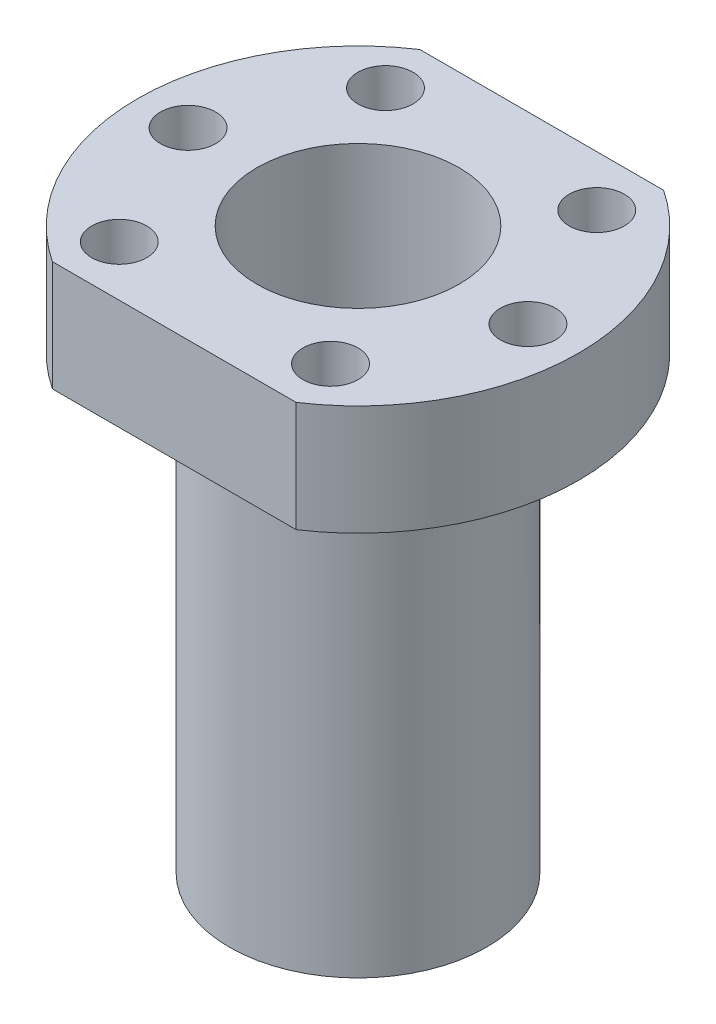
ISO-10303-21;
HEADER;
FILE_DESCRIPTION(('STEP AP214'),'2;1');
FILE_NAME('part.step','',(''),(''),'','','');
FILE_SCHEMA(('AUTOMOTIVE_DESIGN { 1 0 10303 214 1 1 1 1 }'));
ENDSEC;
DATA;
#1=APPLICATION_CONTEXT('core data for automotive mechanical design processes');
#2=APPLICATION_PROTOCOL_DEFINITION('international standard','automotive_design',2000,#1);
#3=PRODUCT_CONTEXT('',#1,'mechanical');
#4=PRODUCT('Part','Part','',(#3));
#5=PRODUCT_RELATED_PRODUCT_CATEGORY('part','',(#4));
#6=PRODUCT_DEFINITION_FORMATION('','',#4);
#7=PRODUCT_DEFINITION_CONTEXT('part definition',#1,'design');
#8=PRODUCT_DEFINITION('design','',#6,#7);
#9=PRODUCT_DEFINITION_SHAPE('','',#8);
#10=(LENGTH_UNIT() NAMED_UNIT(*) SI_UNIT(.MILLI.,.METRE.));
#11=(NAMED_UNIT(*) PLANE_ANGLE_UNIT() SI_UNIT($,.RADIAN.));
#12=(NAMED_UNIT(*) SI_UNIT($,.STERADIAN.) SOLID_ANGLE_UNIT());
#13=UNCERTAINTY_MEASURE_WITH_UNIT(LENGTH_MEASURE(1.E-05),#10,'distance_accuracy_value','');
#14=(GEOMETRIC_REPRESENTATION_CONTEXT(3) GLOBAL_UNCERTAINTY_ASSIGNED_CONTEXT((#13)) GLOBAL_UNIT_ASSIGNED_CONTEXT((#10,
#11,#12)) REPRESENTATION_CONTEXT('',''));
#15=CARTESIAN_POINT('',(0.,0.,0.));
#16=DIRECTION('',(0.,0.,1.));
#17=DIRECTION('',(1.,0.,0.));
#18=AXIS2_PLACEMENT_3D('',#15,#16,#17);
#19=CARTESIAN_POINT('',(0.,0.,0.));
#20=DIRECTION('',(0.,1.,0.));
#21=DIRECTION('',(0.,0.,1.));
#22=AXIS2_PLACEMENT_3D('',#19,#20,#21);
#23=PLANE('',#22);
#24=CARTESIAN_POINT('',(11.5,0.,-14.4913767461894));
#25=DIRECTION('',(0.,1.,0.));
#26=DIRECTION('',(0.,0.,1.));
#27=AXIS2_PLACEMENT_3D('',#24,#25,#26);
#28=CIRCLE('',#27,3.);
#29=CARTESIAN_POINT('',(11.5,0.,-11.4913767461894));
#30=VERTEX_POINT('',#29);
#31=EDGE_CURVE('E241',#30,#30,#28,.T.);
#32=ORIENTED_EDGE('',*,*,#31,.T.);
#33=EDGE_LOOP('',(#32));
#34=FACE_BOUND('',#33,.T.);
#35=CARTESIAN_POINT('',(18.5,0.,0.));
#36=DIRECTION('',(0.,1.,0.));
#37=DIRECTION('',(0.,0.,1.));
#38=AXIS2_PLACEMENT_3D('',#35,#36,#37);
#39=CIRCLE('',#38,3.);
#40=CARTESIAN_POINT('',(18.5,0.,3.));
#41=VERTEX_POINT('',#40);
#42=EDGE_CURVE('E245',#41,#41,#39,.T.);
#43=ORIENTED_EDGE('',*,*,#42,.T.);
#44=EDGE_LOOP('',(#43));
#45=FACE_BOUND('',#44,.T.);
#46=CARTESIAN_POINT('',(11.5,0.,14.4913767461894));
#47=DIRECTION('',(0.,1.,0.));
#48=DIRECTION('',(0.,0.,1.));
#49=AXIS2_PLACEMENT_3D('',#46,#47,#48);
#50=CIRCLE('',#49,3.);
#51=CARTESIAN_POINT('',(11.5,0.,17.4913767461894));
#52=VERTEX_POINT('',#51);
#53=EDGE_CURVE('E254',#52,#52,#50,.T.);
#54=ORIENTED_EDGE('',*,*,#53,.T.);
#55=EDGE_LOOP('',(#54));
#56=FACE_BOUND('',#55,.T.);
#57=CARTESIAN_POINT('',(-11.5,0.,14.4913767461894));
#58=DIRECTION('',(0.,1.,0.));
#59=DIRECTION('',(0.,0.,1.));
#60=AXIS2_PLACEMENT_3D('',#57,#58,#59);
#61=CIRCLE('',#60,3.);
#62=CARTESIAN_POINT('',(-11.5,0.,17.4913767461894));
#63=VERTEX_POINT('',#62);
#64=EDGE_CURVE('E260',#63,#63,#61,.T.);
#65=ORIENTED_EDGE('',*,*,#64,.T.);
#66=EDGE_LOOP('',(#65));
#67=FACE_BOUND('',#66,.T.);
#68=CARTESIAN_POINT('',(-18.5,0.,0.));
#69=DIRECTION('',(0.,1.,0.));
#70=DIRECTION('',(0.,0.,1.));
#71=AXIS2_PLACEMENT_3D('',#68,#69,#70);
#72=CIRCLE('',#71,3.);
#73=CARTESIAN_POINT('',(-18.5,0.,3.));
#74=VERTEX_POINT('',#73);
#75=EDGE_CURVE('E266',#74,#74,#72,.T.);
#76=ORIENTED_EDGE('',*,*,#75,.T.);
#77=EDGE_LOOP('',(#76));
#78=FACE_BOUND('',#77,.T.);
#79=CARTESIAN_POINT('',(-11.5,0.,-14.4913767461894));
#80=DIRECTION('',(0.,1.,0.));
#81=DIRECTION('',(0.,0.,1.));
#82=AXIS2_PLACEMENT_3D('',#79,#80,#81);
#83=CIRCLE('',#82,3.);
#84=CARTESIAN_POINT('',(-11.5,0.,-11.4913767461894));
#85=VERTEX_POINT('',#84);
#86=EDGE_CURVE('E272',#85,#85,#83,.T.);
#87=ORIENTED_EDGE('',*,*,#86,.T.);
#88=EDGE_LOOP('',(#87));
#89=FACE_BOUND('',#88,.T.);
#90=CARTESIAN_POINT('',(0.,0.,0.));
#91=DIRECTION('',(0.,1.,0.));
#92=DIRECTION('',(0.,0.,1.));
#93=AXIS2_PLACEMENT_3D('',#90,#91,#92);
#94=CIRCLE('',#93,24.);
#95=CARTESIAN_POINT('',(-13.2664991614216,0.,-20.));
#96=VERTEX_POINT('',#95);
#97=CARTESIAN_POINT('',(-13.2664991614216,0.,20.));
#98=VERTEX_POINT('',#97);
#99=EDGE_CURVE('E89',#96,#98,#94,.T.);
#100=ORIENTED_EDGE('',*,*,#99,.F.);
#101=DIRECTION('',(-1.,0.,0.));
#102=VECTOR('',#101,1.);
#103=CARTESIAN_POINT('',(0.,0.,-20.));
#104=LINE('',#103,#102);
#105=CARTESIAN_POINT('',(13.2664991614216,0.,-20.));
#106=VERTEX_POINT('',#105);
#107=EDGE_CURVE('E104',#106,#96,#104,.T.);
#108=ORIENTED_EDGE('',*,*,#107,.F.);
#109=CARTESIAN_POINT('',(0.,0.,0.));
#110=DIRECTION('',(0.,1.,0.));
#111=DIRECTION('',(0.,0.,1.));
#112=AXIS2_PLACEMENT_3D('',#109,#110,#111);
#113=CIRCLE('',#112,24.);
#114=CARTESIAN_POINT('',(13.2664991614216,0.,20.));
#115=VERTEX_POINT('',#114);
#116=EDGE_CURVE('E74',#115,#106,#113,.T.);
#117=ORIENTED_EDGE('',*,*,#116,.F.);
#118=DIRECTION('',(1.,0.,0.));
#119=VECTOR('',#118,1.);
#120=CARTESIAN_POINT('',(13.2664991614216,0.,20.));
#121=LINE('',#120,#119);
#122=EDGE_CURVE('E67',#98,#115,#121,.T.);
#123=ORIENTED_EDGE('',*,*,#122,.F.);
#124=EDGE_LOOP('',(#100,#108,#117,#123));
#125=FACE_BOUND('',#124,.T.);
#126=CARTESIAN_POINT('',(0.,0.,0.));
#127=DIRECTION('',(0.,1.,0.));
#128=DIRECTION('',(0.,0.,1.));
#129=AXIS2_PLACEMENT_3D('',#126,#127,#128);
#130=CIRCLE('',#129,14.);
#131=CARTESIAN_POINT('',(0.,0.,14.));
#132=VERTEX_POINT('',#131);
#133=EDGE_CURVE('E11',#132,#132,#130,.F.);
#134=ORIENTED_EDGE('',*,*,#133,.F.);
#135=EDGE_LOOP('',(#134));
#136=FACE_BOUND('',#135,.T.);
#137=ADVANCED_FACE('F32',(#34,#45,#56,#67,#78,#89,#125,#136),#23,.F.);
#138=CARTESIAN_POINT('',(0.,12.,0.));
#139=DIRECTION('',(0.,-1.,0.));
#140=DIRECTION('',(0.,0.,-1.));
#141=AXIS2_PLACEMENT_3D('',#138,#139,#140);
#142=CYLINDRICAL_SURFACE('',#141,24.);
#143=ORIENTED_EDGE('',*,*,#99,.T.);
#144=DIRECTION('',(0.,-1.,0.));
#145=VECTOR('',#144,1.);
#146=CARTESIAN_POINT('',(-13.2664991614216,12.,20.));
#147=LINE('',#146,#145);
#148=CARTESIAN_POINT('',(-13.2664991614216,12.,20.));
#149=VERTEX_POINT('',#148);
#150=EDGE_CURVE('E87',#149,#98,#147,.T.);
#151=ORIENTED_EDGE('',*,*,#150,.F.);
#152=CARTESIAN_POINT('',(0.,12.,0.));
#153=DIRECTION('',(0.,1.,0.));
#154=DIRECTION('',(0.,0.,1.));
#155=AXIS2_PLACEMENT_3D('',#152,#153,#154);
#156=CIRCLE('',#155,24.);
#157=CARTESIAN_POINT('',(-13.2664991614216,12.,-20.));
#158=VERTEX_POINT('',#157);
#159=EDGE_CURVE('E81',#158,#149,#156,.T.);
#160=ORIENTED_EDGE('',*,*,#159,.F.);
#161=DIRECTION('',(0.,-1.,0.));
#162=VECTOR('',#161,1.);
#163=CARTESIAN_POINT('',(-13.2664991614216,12.,-20.));
#164=LINE('',#163,#162);
#165=EDGE_CURVE('E41',#158,#96,#164,.T.);
#166=ORIENTED_EDGE('',*,*,#165,.T.);
#167=EDGE_LOOP('',(#143,#151,#160,#166));
#168=FACE_BOUND('',#167,.T.);
#169=ADVANCED_FACE('F34',(#168),#142,.T.);
#170=CARTESIAN_POINT('',(13.2664991614216,12.,20.));
#171=DIRECTION('',(0.,0.,-1.));
#172=DIRECTION('',(-1.,0.,0.));
#173=AXIS2_PLACEMENT_3D('',#170,#171,#172);
#174=PLANE('',#173);
#175=ORIENTED_EDGE('',*,*,#122,.T.);
#176=DIRECTION('',(0.,-1.,0.));
#177=VECTOR('',#176,1.);
#178=CARTESIAN_POINT('',(13.2664991614216,12.,20.));
#179=LINE('',#178,#177);
#180=CARTESIAN_POINT('',(13.2664991614216,12.,20.));
#181=VERTEX_POINT('',#180);
#182=EDGE_CURVE('E90',#181,#115,#179,.T.);
#183=ORIENTED_EDGE('',*,*,#182,.F.);
#184=DIRECTION('',(1.,0.,0.));
#185=VECTOR('',#184,1.);
#186=CARTESIAN_POINT('',(13.2664991614216,12.,20.));
#187=LINE('',#186,#185);
#188=EDGE_CURVE('E85',#149,#181,#187,.T.);
#189=ORIENTED_EDGE('',*,*,#188,.F.);
#190=ORIENTED_EDGE('',*,*,#150,.T.);
#191=EDGE_LOOP('',(#175,#183,#189,#190));
#192=FACE_BOUND('',#191,.T.);
#193=ADVANCED_FACE('F92',(#192),#174,.F.);
#194=CARTESIAN_POINT('',(0.,12.,0.));
#195=DIRECTION('',(0.,-1.,0.));
#196=DIRECTION('',(0.,0.,-1.));
#197=AXIS2_PLACEMENT_3D('',#194,#195,#196);
#198=CYLINDRICAL_SURFACE('',#197,24.);
#199=ORIENTED_EDGE('',*,*,#116,.T.);
#200=DIRECTION('',(0.,-1.,0.));
#201=VECTOR('',#200,1.);
#202=CARTESIAN_POINT('',(13.2664991614216,12.,-20.));
#203=LINE('',#202,#201);
#204=CARTESIAN_POINT('',(13.2664991614216,12.,-20.));
#205=VERTEX_POINT('',#204);
#206=EDGE_CURVE('E96',#205,#106,#203,.T.);
#207=ORIENTED_EDGE('',*,*,#206,.F.);
#208=CARTESIAN_POINT('',(0.,12.,0.));
#209=DIRECTION('',(0.,1.,0.));
#210=DIRECTION('',(0.,0.,1.));
#211=AXIS2_PLACEMENT_3D('',#208,#209,#210);
#212=CIRCLE('',#211,24.);
#213=EDGE_CURVE('E94',#181,#205,#212,.T.);
#214=ORIENTED_EDGE('',*,*,#213,.F.);
#215=ORIENTED_EDGE('',*,*,#182,.T.);
#216=EDGE_LOOP('',(#199,#207,#214,#215));
#217=FACE_BOUND('',#216,.T.);
#218=ADVANCED_FACE('F135',(#217),#198,.T.);
#219=CARTESIAN_POINT('',(0.,12.,-20.));
#220=DIRECTION('',(0.,0.,1.));
#221=DIRECTION('',(1.,0.,0.));
#222=AXIS2_PLACEMENT_3D('',#219,#220,#221);
#223=PLANE('',#222);
#224=ORIENTED_EDGE('',*,*,#107,.T.);
#225=ORIENTED_EDGE('',*,*,#165,.F.);
#226=DIRECTION('',(-1.,0.,0.));
#227=VECTOR('',#226,1.);
#228=CARTESIAN_POINT('',(-13.2664991614216,12.,-20.));
#229=LINE('',#228,#227);
#230=EDGE_CURVE('E49',#205,#158,#229,.T.);
#231=ORIENTED_EDGE('',*,*,#230,.F.);
#232=ORIENTED_EDGE('',*,*,#206,.T.);
#233=EDGE_LOOP('',(#224,#225,#231,#232));
#234=FACE_BOUND('',#233,.T.);
#235=ADVANCED_FACE('F107',(#234),#223,.F.);
#236=CARTESIAN_POINT('',(0.,12.,0.));
#237=DIRECTION('',(0.,1.,0.));
#238=DIRECTION('',(0.,0.,1.));
#239=AXIS2_PLACEMENT_3D('',#236,#237,#238);
#240=PLANE('',#239);
#241=CARTESIAN_POINT('',(11.5,12.,-14.4913767461894));
#242=DIRECTION('',(0.,1.,0.));
#243=DIRECTION('',(0.,0.,1.));
#244=AXIS2_PLACEMENT_3D('',#241,#242,#243);
#245=CIRCLE('',#244,3.);
#246=CARTESIAN_POINT('',(11.5,12.,-11.4913767461894));
#247=VERTEX_POINT('',#246);
#248=EDGE_CURVE('E238',#247,#247,#245,.T.);
#249=ORIENTED_EDGE('',*,*,#248,.F.);
#250=EDGE_LOOP('',(#249));
#251=FACE_BOUND('',#250,.T.);
#252=CARTESIAN_POINT('',(18.5,12.,0.));
#253=DIRECTION('',(0.,1.,0.));
#254=DIRECTION('',(0.,0.,1.));
#255=AXIS2_PLACEMENT_3D('',#252,#253,#254);
#256=CIRCLE('',#255,3.);
#257=CARTESIAN_POINT('',(18.5,12.,3.));
#258=VERTEX_POINT('',#257);
#259=EDGE_CURVE('E242',#258,#258,#256,.T.);
#260=ORIENTED_EDGE('',*,*,#259,.F.);
#261=EDGE_LOOP('',(#260));
#262=FACE_BOUND('',#261,.T.);
#263=CARTESIAN_POINT('',(11.5,12.,14.4913767461894));
#264=DIRECTION('',(0.,1.,0.));
#265=DIRECTION('',(0.,0.,1.));
#266=AXIS2_PLACEMENT_3D('',#263,#264,#265);
#267=CIRCLE('',#266,3.);
#268=CARTESIAN_POINT('',(11.5,12.,17.4913767461894));
#269=VERTEX_POINT('',#268);
#270=EDGE_CURVE('E251',#269,#269,#267,.T.);
#271=ORIENTED_EDGE('',*,*,#270,.F.);
#272=EDGE_LOOP('',(#271));
#273=FACE_BOUND('',#272,.T.);
#274=CARTESIAN_POINT('',(-11.5,12.,14.4913767461894));
#275=DIRECTION('',(0.,1.,0.));
#276=DIRECTION('',(0.,0.,1.));
#277=AXIS2_PLACEMENT_3D('',#274,#275,#276);
#278=CIRCLE('',#277,3.);
#279=CARTESIAN_POINT('',(-11.5,12.,17.4913767461894));
#280=VERTEX_POINT('',#279);
#281=EDGE_CURVE('E257',#280,#280,#278,.T.);
#282=ORIENTED_EDGE('',*,*,#281,.F.);
#283=EDGE_LOOP('',(#282));
#284=FACE_BOUND('',#283,.T.);
#285=CARTESIAN_POINT('',(-18.5,12.,0.));
#286=DIRECTION('',(0.,1.,0.));
#287=DIRECTION('',(0.,0.,1.));
#288=AXIS2_PLACEMENT_3D('',#285,#286,#287);
#289=CIRCLE('',#288,3.);
#290=CARTESIAN_POINT('',(-18.5,12.,3.));
#291=VERTEX_POINT('',#290);
#292=EDGE_CURVE('E263',#291,#291,#289,.T.);
#293=ORIENTED_EDGE('',*,*,#292,.F.);
#294=EDGE_LOOP('',(#293));
#295=FACE_BOUND('',#294,.T.);
#296=CARTESIAN_POINT('',(-11.5,12.,-14.4913767461894));
#297=DIRECTION('',(0.,1.,0.));
#298=DIRECTION('',(0.,0.,1.));
#299=AXIS2_PLACEMENT_3D('',#296,#297,#298);
#300=CIRCLE('',#299,3.);
#301=CARTESIAN_POINT('',(-11.5,12.,-11.4913767461894));
#302=VERTEX_POINT('',#301);
#303=EDGE_CURVE('E269',#302,#302,#300,.T.);
#304=ORIENTED_EDGE('',*,*,#303,.F.);
#305=EDGE_LOOP('',(#304));
#306=FACE_BOUND('',#305,.T.);
#307=CARTESIAN_POINT('',(0.,12.,0.));
#308=DIRECTION('',(0.,1.,0.));
#309=DIRECTION('',(0.,0.,1.));
#310=AXIS2_PLACEMENT_3D('',#307,#308,#309);
#311=CIRCLE('',#310,11.);
#312=CARTESIAN_POINT('',(0.,12.,11.));
#313=VERTEX_POINT('',#312);
#314=EDGE_CURVE('E275',#313,#313,#311,.T.);
#315=ORIENTED_EDGE('',*,*,#314,.F.);
#316=EDGE_LOOP('',(#315));
#317=FACE_BOUND('',#316,.T.);
#318=ORIENTED_EDGE('',*,*,#230,.T.);
#319=ORIENTED_EDGE('',*,*,#159,.T.);
#320=ORIENTED_EDGE('',*,*,#188,.T.);
#321=ORIENTED_EDGE('',*,*,#213,.T.);
#322=EDGE_LOOP('',(#318,#319,#320,#321));
#323=FACE_BOUND('',#322,.T.);
#324=ADVANCED_FACE('F83',(#251,#262,#273,#284,#295,#306,#317,#323),#240,.T.);
#325=CARTESIAN_POINT('',(0.,-49.,0.));
#326=DIRECTION('',(0.,1.,0.));
#327=DIRECTION('',(0.,0.,1.));
#328=AXIS2_PLACEMENT_3D('',#325,#326,#327);
#329=CYLINDRICAL_SURFACE('',#328,14.);
#330=CARTESIAN_POINT('',(0.,-49.,0.));
#331=DIRECTION('',(0.,-1.,0.));
#332=DIRECTION('',(0.,0.,-1.));
#333=AXIS2_PLACEMENT_3D('',#330,#331,#332);
#334=CIRCLE('',#333,14.);
#335=CARTESIAN_POINT('',(0.,-49.,-14.));
#336=VERTEX_POINT('',#335);
#337=EDGE_CURVE('E101',#336,#336,#334,.T.);
#338=ORIENTED_EDGE('',*,*,#337,.F.);
#339=EDGE_LOOP('',(#338));
#340=FACE_BOUND('',#339,.T.);
#341=ORIENTED_EDGE('',*,*,#133,.T.);
#342=EDGE_LOOP('',(#341));
#343=FACE_BOUND('',#342,.T.);
#344=ADVANCED_FACE('F116',(#340,#343),#329,.T.);
#345=CARTESIAN_POINT('',(0.,-49.,0.));
#346=DIRECTION('',(0.,-1.,0.));
#347=DIRECTION('',(0.,0.,-1.));
#348=AXIS2_PLACEMENT_3D('',#345,#346,#347);
#349=PLANE('',#348);
#350=CARTESIAN_POINT('',(0.,-49.,0.));
#351=DIRECTION('',(0.,1.,0.));
#352=DIRECTION('',(0.,0.,1.));
#353=AXIS2_PLACEMENT_3D('',#350,#351,#352);
#354=CIRCLE('',#353,11.);
#355=CARTESIAN_POINT('',(0.,-49.,11.));
#356=VERTEX_POINT('',#355);
#357=EDGE_CURVE('E276',#356,#356,#354,.T.);
#358=ORIENTED_EDGE('',*,*,#357,.T.);
#359=EDGE_LOOP('',(#358));
#360=FACE_BOUND('',#359,.T.);
#361=ORIENTED_EDGE('',*,*,#337,.T.);
#362=EDGE_LOOP('',(#361));
#363=FACE_BOUND('',#362,.T.);
#364=ADVANCED_FACE('F118',(#360,#363),#349,.T.);
#365=CARTESIAN_POINT('',(0.,-49.,0.));
#366=DIRECTION('',(0.,1.,0.));
#367=DIRECTION('',(0.,0.,1.));
#368=AXIS2_PLACEMENT_3D('',#365,#366,#367);
#369=CYLINDRICAL_SURFACE('',#368,11.);
#370=CARTESIAN_POINT('',(0.,-49.,11.));
#371=CARTESIAN_POINT('',(0.,-48.3645833333333,11.));
#372=CARTESIAN_POINT('',(0.,-47.7291666666667,11.));
#373=CARTESIAN_POINT('',(0.,-46.4583333333333,11.));
#374=CARTESIAN_POINT('',(0.,-45.8229166666667,11.));
#375=CARTESIAN_POINT('',(0.,-44.5520833333333,11.));
#376=CARTESIAN_POINT('',(0.,-43.9166666666667,11.));
#377=CARTESIAN_POINT('',(0.,-42.6458333333333,11.));
#378=CARTESIAN_POINT('',(0.,-42.0104166666667,11.));
#379=CARTESIAN_POINT('',(0.,-40.7395833333333,11.));
#380=CARTESIAN_POINT('',(0.,-40.1041666666667,11.));
#381=CARTESIAN_POINT('',(0.,-38.8333333333333,11.));
#382=CARTESIAN_POINT('',(0.,-38.1979166666667,11.));
#383=CARTESIAN_POINT('',(0.,-36.9270833333333,11.));
#384=CARTESIAN_POINT('',(0.,-36.2916666666667,11.));
#385=CARTESIAN_POINT('',(0.,-35.0208333333333,11.));
#386=CARTESIAN_POINT('',(0.,-34.3854166666667,11.));
#387=CARTESIAN_POINT('',(0.,-33.1145833333333,11.));
#388=CARTESIAN_POINT('',(0.,-32.4791666666667,11.));
#389=CARTESIAN_POINT('',(0.,-31.2083333333333,11.));
#390=CARTESIAN_POINT('',(0.,-30.5729166666667,11.));
#391=CARTESIAN_POINT('',(0.,-29.3020833333333,11.));
#392=CARTESIAN_POINT('',(0.,-28.6666666666667,11.));
#393=CARTESIAN_POINT('',(0.,-27.3958333333333,11.));
#394=CARTESIAN_POINT('',(0.,-26.7604166666667,11.));
#395=CARTESIAN_POINT('',(0.,-25.4895833333333,11.));
#396=CARTESIAN_POINT('',(0.,-24.8541666666667,11.));
#397=CARTESIAN_POINT('',(0.,-23.5833333333333,11.));
#398=CARTESIAN_POINT('',(0.,-22.9479166666667,11.));
#399=CARTESIAN_POINT('',(0.,-21.6770833333333,11.));
#400=CARTESIAN_POINT('',(0.,-21.0416666666667,11.));
#401=CARTESIAN_POINT('',(0.,-19.7708333333333,11.));
#402=CARTESIAN_POINT('',(0.,-19.1354166666667,11.));
#403=CARTESIAN_POINT('',(0.,-17.8645833333333,11.));
#404=CARTESIAN_POINT('',(0.,-17.2291666666667,11.));
#405=CARTESIAN_POINT('',(0.,-15.9583333333333,11.));
#406=CARTESIAN_POINT('',(0.,-15.3229166666667,11.));
#407=CARTESIAN_POINT('',(0.,-14.0520833333333,11.));
#408=CARTESIAN_POINT('',(0.,-13.4166666666667,11.));
#409=CARTESIAN_POINT('',(0.,-12.1458333333333,11.));
#410=CARTESIAN_POINT('',(0.,-11.5104166666667,11.));
#411=CARTESIAN_POINT('',(0.,-10.2395833333333,11.));
#412=CARTESIAN_POINT('',(0.,-9.60416666666667,11.));
#413=CARTESIAN_POINT('',(0.,-8.33333333333334,11.));
#414=CARTESIAN_POINT('',(0.,-7.69791666666667,11.));
#415=CARTESIAN_POINT('',(0.,-6.42708333333333,11.));
#416=CARTESIAN_POINT('',(0.,-5.79166666666667,11.));
#417=CARTESIAN_POINT('',(0.,-4.52083333333333,11.));
#418=CARTESIAN_POINT('',(0.,-3.88541666666667,11.));
#419=CARTESIAN_POINT('',(0.,-2.61458333333333,11.));
#420=CARTESIAN_POINT('',(0.,-1.97916666666667,11.));
#421=CARTESIAN_POINT('',(0.,-0.708333333333332,11.));
#422=CARTESIAN_POINT('',(0.,-0.0729166666666655,11.));
#423=CARTESIAN_POINT('',(0.,1.19791666666667,11.));
#424=CARTESIAN_POINT('',(0.,1.83333333333333,11.));
#425=CARTESIAN_POINT('',(0.,3.10416666666667,11.));
#426=CARTESIAN_POINT('',(0.,3.73958333333334,11.));
#427=CARTESIAN_POINT('',(0.,5.01041666666667,11.));
#428=CARTESIAN_POINT('',(0.,5.64583333333334,11.));
#429=CARTESIAN_POINT('',(0.,6.91666666666667,11.));
#430=CARTESIAN_POINT('',(0.,7.55208333333333,11.));
#431=CARTESIAN_POINT('',(0.,8.82291666666667,11.));
#432=CARTESIAN_POINT('',(0.,9.45833333333334,11.));
#433=CARTESIAN_POINT('',(0.,10.7291666666667,11.));
#434=CARTESIAN_POINT('',(0.,11.3645833333333,11.));
#435=CARTESIAN_POINT('',(0.,12.,11.));
#436=B_SPLINE_CURVE_WITH_KNOTS('',3,(#370,#371,#372,#373,#374,#375,#376,#377,#378,#379,#380,
#381,#382,#383,#384,#385,#386,#387,#388,#389,#390,#391,#392,#393,#394,#395,#396,#397,#398,#399,
#400,#401,#402,#403,#404,#405,#406,#407,#408,#409,#410,#411,#412,#413,#414,#415,#416,#417,#418,
#419,#420,#421,#422,#423,#424,#425,#426,#427,#428,#429,#430,#431,#432,#433,#434,#435),
.UNSPECIFIED.,.F.,.F.,(4,2,2,2,2,2,2,2,2,2,2,2,2,2,2,2,2,2,2,2,2,2,2,2,2,2,2,2,2,2,2,2,4),(0.,
1.90625000000001,3.8125,5.71875,7.62500000000001,9.53125000000001,11.4375,13.34375,15.25,
17.15625,19.0625,20.96875,22.875,24.78125,26.6875,28.59375,30.5,32.40625,34.3125,36.21875,
38.125,40.03125,41.9375,43.84375,45.75,47.65625,49.5625,51.46875,53.375,55.28125,57.1875,
59.09375,61.),.UNSPECIFIED.);
#437=EDGE_CURVE('BSEAM125',#356,#313,#436,.T.);
#438=ORIENTED_EDGE('',*,*,#357,.F.);
#439=ORIENTED_EDGE('',*,*,#314,.T.);
#440=ORIENTED_EDGE('',*,*,#437,.T.);
#441=ORIENTED_EDGE('',*,*,#437,.F.);
#442=EDGE_LOOP('',(#438,#440,#439,#441));
#443=FACE_BOUND('',#442,.T.);
#444=ADVANCED_FACE('F125',(#443),#369,.F.);
#445=CARTESIAN_POINT('',(-11.5,-49.,-14.4913767461894));
#446=DIRECTION('',(0.,1.,0.));
#447=DIRECTION('',(0.,0.,1.));
#448=AXIS2_PLACEMENT_3D('',#445,#446,#447);
#449=CYLINDRICAL_SURFACE('',#448,3.);
#450=CARTESIAN_POINT('',(-11.5,12.,-11.4913767461894));
#451=CARTESIAN_POINT('',(-11.5,11.875,-11.4913767461894));
#452=CARTESIAN_POINT('',(-11.5,11.75,-11.4913767461894));
#453=CARTESIAN_POINT('',(-11.5,11.5,-11.4913767461894));
#454=CARTESIAN_POINT('',(-11.5,11.375,-11.4913767461894));
#455=CARTESIAN_POINT('',(-11.5,11.125,-11.4913767461894));
#456=CARTESIAN_POINT('',(-11.5,11.,-11.4913767461894));
#457=CARTESIAN_POINT('',(-11.5,10.75,-11.4913767461894));
#458=CARTESIAN_POINT('',(-11.5,10.625,-11.4913767461894));
#459=CARTESIAN_POINT('',(-11.5,10.375,-11.4913767461894));
#460=CARTESIAN_POINT('',(-11.5,10.25,-11.4913767461894));
#461=CARTESIAN_POINT('',(-11.5,10.,-11.4913767461894));
#462=CARTESIAN_POINT('',(-11.5,9.875,-11.4913767461894));
#463=CARTESIAN_POINT('',(-11.5,9.625,-11.4913767461894));
#464=CARTESIAN_POINT('',(-11.5,9.5,-11.4913767461894));
#465=CARTESIAN_POINT('',(-11.5,9.25,-11.4913767461894));
#466=CARTESIAN_POINT('',(-11.5,9.125,-11.4913767461894));
#467=CARTESIAN_POINT('',(-11.5,8.875,-11.4913767461894));
#468=CARTESIAN_POINT('',(-11.5,8.75,-11.4913767461894));
#469=CARTESIAN_POINT('',(-11.5,8.5,-11.4913767461894));
#470=CARTESIAN_POINT('',(-11.5,8.375,-11.4913767461894));
#471=CARTESIAN_POINT('',(-11.5,8.125,-11.4913767461894));
#472=CARTESIAN_POINT('',(-11.5,8.,-11.4913767461894));
#473=CARTESIAN_POINT('',(-11.5,7.75,-11.4913767461894));
#474=CARTESIAN_POINT('',(-11.5,7.625,-11.4913767461894));
#475=CARTESIAN_POINT('',(-11.5,7.375,-11.4913767461894));
#476=CARTESIAN_POINT('',(-11.5,7.25,-11.4913767461894));
#477=CARTESIAN_POINT('',(-11.5,7.,-11.4913767461894));
#478=CARTESIAN_POINT('',(-11.5,6.875,-11.4913767461894));
#479=CARTESIAN_POINT('',(-11.5,6.625,-11.4913767461894));
#480=CARTESIAN_POINT('',(-11.5,6.5,-11.4913767461894));
#481=CARTESIAN_POINT('',(-11.5,6.25,-11.4913767461894));
#482=CARTESIAN_POINT('',(-11.5,6.125,-11.4913767461894));
#483=CARTESIAN_POINT('',(-11.5,5.875,-11.4913767461894));
#484=CARTESIAN_POINT('',(-11.5,5.75,-11.4913767461894));
#485=CARTESIAN_POINT('',(-11.5,5.5,-11.4913767461894));
#486=CARTESIAN_POINT('',(-11.5,5.375,-11.4913767461894));
#487=CARTESIAN_POINT('',(-11.5,5.125,-11.4913767461894));
#488=CARTESIAN_POINT('',(-11.5,5.,-11.4913767461894));
#489=CARTESIAN_POINT('',(-11.5,4.75,-11.4913767461894));
#490=CARTESIAN_POINT('',(-11.5,4.625,-11.4913767461894));
#491=CARTESIAN_POINT('',(-11.5,4.375,-11.4913767461894));
#492=CARTESIAN_POINT('',(-11.5,4.25,-11.4913767461894));
#493=CARTESIAN_POINT('',(-11.5,4.,-11.4913767461894));
#494=CARTESIAN_POINT('',(-11.5,3.875,-11.4913767461894));
#495=CARTESIAN_POINT('',(-11.5,3.625,-11.4913767461894));
#496=CARTESIAN_POINT('',(-11.5,3.5,-11.4913767461894));
#497=CARTESIAN_POINT('',(-11.5,3.25,-11.4913767461894));
#498=CARTESIAN_POINT('',(-11.5,3.125,-11.4913767461894));
#499=CARTESIAN_POINT('',(-11.5,2.875,-11.4913767461894));
#500=CARTESIAN_POINT('',(-11.5,2.75,-11.4913767461894));
#501=CARTESIAN_POINT('',(-11.5,2.5,-11.4913767461894));
#502=CARTESIAN_POINT('',(-11.5,2.375,-11.4913767461894));
#503=CARTESIAN_POINT('',(-11.5,2.125,-11.4913767461894));
#504=CARTESIAN_POINT('',(-11.5,1.99999999999999,-11.4913767461894));
#505=CARTESIAN_POINT('',(-11.5,1.74999999999999,-11.4913767461894));
#506=CARTESIAN_POINT('',(-11.5,1.62499999999999,-11.4913767461894));
#507=CARTESIAN_POINT('',(-11.5,1.37499999999999,-11.4913767461894));
#508=CARTESIAN_POINT('',(-11.5,1.24999999999999,-11.4913767461894));
#509=CARTESIAN_POINT('',(-11.5,0.999999999999994,-11.4913767461894));
#510=CARTESIAN_POINT('',(-11.5,0.874999999999994,-11.4913767461894));
#511=CARTESIAN_POINT('',(-11.5,0.624999999999994,-11.4913767461894));
#512=CARTESIAN_POINT('',(-11.5,0.499999999999994,-11.4913767461894));
#513=CARTESIAN_POINT('',(-11.5,0.249999999999993,-11.4913767461894));
#514=CARTESIAN_POINT('',(-11.5,0.124999999999993,-11.4913767461894));
#515=CARTESIAN_POINT('',(-11.5,0.,-11.4913767461894));
#516=B_SPLINE_CURVE_WITH_KNOTS('',3,(#450,#451,#452,#453,#454,#455,#456,#457,#458,#459,#460,
#461,#462,#463,#464,#465,#466,#467,#468,#469,#470,#471,#472,#473,#474,#475,#476,#477,#478,#479,
#480,#481,#482,#483,#484,#485,#486,#487,#488,#489,#490,#491,#492,#493,#494,#495,#496,#497,#498,
#499,#500,#501,#502,#503,#504,#505,#506,#507,#508,#509,#510,#511,#512,#513,#514,#515),
.UNSPECIFIED.,.F.,.F.,(4,2,2,2,2,2,2,2,2,2,2,2,2,2,2,2,2,2,2,2,2,2,2,2,2,2,2,2,2,2,2,2,4),(0.,
0.375,0.750000000000001,1.125,1.5,1.875,2.25,2.625,3.,3.375,3.75,4.125,4.5,4.875,5.25,
5.62500000000001,6.00000000000001,6.37500000000001,6.75000000000001,7.12500000000001,
7.50000000000001,7.87500000000001,8.25000000000001,8.62500000000001,9.00000000000001,
9.37500000000001,9.75000000000001,10.125,10.5,10.875,11.25,11.625,12.),.UNSPECIFIED.);
#517=EDGE_CURVE('BSEAM172',#302,#85,#516,.T.);
#518=ORIENTED_EDGE('',*,*,#303,.T.);
#519=ORIENTED_EDGE('',*,*,#86,.F.);
#520=ORIENTED_EDGE('',*,*,#517,.T.);
#521=ORIENTED_EDGE('',*,*,#517,.F.);
#522=EDGE_LOOP('',(#518,#520,#519,#521));
#523=FACE_BOUND('',#522,.T.);
#524=ADVANCED_FACE('F172',(#523),#449,.F.);
#525=CARTESIAN_POINT('',(-18.5,-49.,0.));
#526=DIRECTION('',(0.,1.,0.));
#527=DIRECTION('',(0.,0.,1.));
#528=AXIS2_PLACEMENT_3D('',#525,#526,#527);
#529=CYLINDRICAL_SURFACE('',#528,3.);
#530=CARTESIAN_POINT('',(-18.5,12.,3.));
#531=CARTESIAN_POINT('',(-18.5,11.875,3.));
#532=CARTESIAN_POINT('',(-18.5,11.75,3.));
#533=CARTESIAN_POINT('',(-18.5,11.5,3.));
#534=CARTESIAN_POINT('',(-18.5,11.375,3.));
#535=CARTESIAN_POINT('',(-18.5,11.125,3.));
#536=CARTESIAN_POINT('',(-18.5,11.,3.));
#537=CARTESIAN_POINT('',(-18.5,10.75,3.));
#538=CARTESIAN_POINT('',(-18.5,10.625,3.));
#539=CARTESIAN_POINT('',(-18.5,10.375,3.));
#540=CARTESIAN_POINT('',(-18.5,10.25,3.));
#541=CARTESIAN_POINT('',(-18.5,10.,3.));
#542=CARTESIAN_POINT('',(-18.5,9.875,3.));
#543=CARTESIAN_POINT('',(-18.5,9.625,3.));
#544=CARTESIAN_POINT('',(-18.5,9.5,3.));
#545=CARTESIAN_POINT('',(-18.5,9.25,3.));
#546=CARTESIAN_POINT('',(-18.5,9.125,3.));
#547=CARTESIAN_POINT('',(-18.5,8.875,3.));
#548=CARTESIAN_POINT('',(-18.5,8.75,3.));
#549=CARTESIAN_POINT('',(-18.5,8.5,3.));
#550=CARTESIAN_POINT('',(-18.5,8.375,3.));
#551=CARTESIAN_POINT('',(-18.5,8.125,3.));
#552=CARTESIAN_POINT('',(-18.5,8.,3.));
#553=CARTESIAN_POINT('',(-18.5,7.75,3.));
#554=CARTESIAN_POINT('',(-18.5,7.625,3.));
#555=CARTESIAN_POINT('',(-18.5,7.375,3.));
#556=CARTESIAN_POINT('',(-18.5,7.25,3.));
#557=CARTESIAN_POINT('',(-18.5,7.,3.));
#558=CARTESIAN_POINT('',(-18.5,6.875,3.));
#559=CARTESIAN_POINT('',(-18.5,6.625,3.));
#560=CARTESIAN_POINT('',(-18.5,6.5,3.));
#561=CARTESIAN_POINT('',(-18.5,6.25,3.));
#562=CARTESIAN_POINT('',(-18.5,6.125,3.));
#563=CARTESIAN_POINT('',(-18.5,5.875,3.));
#564=CARTESIAN_POINT('',(-18.5,5.75,3.));
#565=CARTESIAN_POINT('',(-18.5,5.5,3.));
#566=CARTESIAN_POINT('',(-18.5,5.375,3.));
#567=CARTESIAN_POINT('',(-18.5,5.125,3.));
#568=CARTESIAN_POINT('',(-18.5,5.,3.));
#569=CARTESIAN_POINT('',(-18.5,4.75,3.));
#570=CARTESIAN_POINT('',(-18.5,4.625,3.));
#571=CARTESIAN_POINT('',(-18.5,4.375,3.));
#572=CARTESIAN_POINT('',(-18.5,4.25,3.));
#573=CARTESIAN_POINT('',(-18.5,4.,3.));
#574=CARTESIAN_POINT('',(-18.5,3.875,3.));
#575=CARTESIAN_POINT('',(-18.5,3.625,3.));
#576=CARTESIAN_POINT('',(-18.5,3.5,3.));
#577=CARTESIAN_POINT('',(-18.5,3.25,3.));
#578=CARTESIAN_POINT('',(-18.5,3.125,3.));
#579=CARTESIAN_POINT('',(-18.5,2.875,3.));
#580=CARTESIAN_POINT('',(-18.5,2.75,3.));
#581=CARTESIAN_POINT('',(-18.5,2.5,3.));
#582=CARTESIAN_POINT('',(-18.5,2.375,3.));
#583=CARTESIAN_POINT('',(-18.5,2.125,3.));
#584=CARTESIAN_POINT('',(-18.5,1.99999999999999,3.));
#585=CARTESIAN_POINT('',(-18.5,1.74999999999999,3.));
#586=CARTESIAN_POINT('',(-18.5,1.62499999999999,3.));
#587=CARTESIAN_POINT('',(-18.5,1.37499999999999,3.));
#588=CARTESIAN_POINT('',(-18.5,1.24999999999999,3.));
#589=CARTESIAN_POINT('',(-18.5,0.999999999999994,3.));
#590=CARTESIAN_POINT('',(-18.5,0.874999999999994,3.));
#591=CARTESIAN_POINT('',(-18.5,0.624999999999994,3.));
#592=CARTESIAN_POINT('',(-18.5,0.499999999999994,3.));
#593=CARTESIAN_POINT('',(-18.5,0.249999999999993,3.));
#594=CARTESIAN_POINT('',(-18.5,0.124999999999993,3.));
#595=CARTESIAN_POINT('',(-18.5,0.,3.));
#596=B_SPLINE_CURVE_WITH_KNOTS('',3,(#530,#531,#532,#533,#534,#535,#536,#537,#538,#539,#540,
#541,#542,#543,#544,#545,#546,#547,#548,#549,#550,#551,#552,#553,#554,#555,#556,#557,#558,#559,
#560,#561,#562,#563,#564,#565,#566,#567,#568,#569,#570,#571,#572,#573,#574,#575,#576,#577,#578,
#579,#580,#581,#582,#583,#584,#585,#586,#587,#588,#589,#590,#591,#592,#593,#594,#595),
.UNSPECIFIED.,.F.,.F.,(4,2,2,2,2,2,2,2,2,2,2,2,2,2,2,2,2,2,2,2,2,2,2,2,2,2,2,2,2,2,2,2,4),(0.,
0.375,0.750000000000001,1.125,1.5,1.875,2.25,2.625,3.,3.375,3.75,4.125,4.5,4.875,5.25,
5.62500000000001,6.00000000000001,6.37500000000001,6.75000000000001,7.12500000000001,
7.50000000000001,7.87500000000001,8.25000000000001,8.62500000000001,9.00000000000001,
9.37500000000001,9.75000000000001,10.125,10.5,10.875,11.25,11.625,12.),.UNSPECIFIED.);
#597=EDGE_CURVE('BSEAM181',#291,#74,#596,.T.);
#598=ORIENTED_EDGE('',*,*,#292,.T.);
#599=ORIENTED_EDGE('',*,*,#75,.F.);
#600=ORIENTED_EDGE('',*,*,#597,.T.);
#601=ORIENTED_EDGE('',*,*,#597,.F.);
#602=EDGE_LOOP('',(#598,#600,#599,#601));
#603=FACE_BOUND('',#602,.T.);
#604=ADVANCED_FACE('F181',(#603),#529,.F.);
#605=CARTESIAN_POINT('',(-11.5,-49.,14.4913767461894));
#606=DIRECTION('',(0.,1.,0.));
#607=DIRECTION('',(0.,0.,1.));
#608=AXIS2_PLACEMENT_3D('',#605,#606,#607);
#609=CYLINDRICAL_SURFACE('',#608,3.);
#610=CARTESIAN_POINT('',(-11.5,12.,17.4913767461894));
#611=CARTESIAN_POINT('',(-11.5,11.875,17.4913767461894));
#612=CARTESIAN_POINT('',(-11.5,11.75,17.4913767461894));
#613=CARTESIAN_POINT('',(-11.5,11.5,17.4913767461894));
#614=CARTESIAN_POINT('',(-11.5,11.375,17.4913767461894));
#615=CARTESIAN_POINT('',(-11.5,11.125,17.4913767461894));
#616=CARTESIAN_POINT('',(-11.5,11.,17.4913767461894));
#617=CARTESIAN_POINT('',(-11.5,10.75,17.4913767461894));
#618=CARTESIAN_POINT('',(-11.5,10.625,17.4913767461894));
#619=CARTESIAN_POINT('',(-11.5,10.375,17.4913767461894));
#620=CARTESIAN_POINT('',(-11.5,10.25,17.4913767461894));
#621=CARTESIAN_POINT('',(-11.5,10.,17.4913767461894));
#622=CARTESIAN_POINT('',(-11.5,9.875,17.4913767461894));
#623=CARTESIAN_POINT('',(-11.5,9.625,17.4913767461894));
#624=CARTESIAN_POINT('',(-11.5,9.5,17.4913767461894));
#625=CARTESIAN_POINT('',(-11.5,9.25,17.4913767461894));
#626=CARTESIAN_POINT('',(-11.5,9.125,17.4913767461894));
#627=CARTESIAN_POINT('',(-11.5,8.875,17.4913767461894));
#628=CARTESIAN_POINT('',(-11.5,8.75,17.4913767461894));
#629=CARTESIAN_POINT('',(-11.5,8.5,17.4913767461894));
#630=CARTESIAN_POINT('',(-11.5,8.375,17.4913767461894));
#631=CARTESIAN_POINT('',(-11.5,8.125,17.4913767461894));
#632=CARTESIAN_POINT('',(-11.5,8.,17.4913767461894));
#633=CARTESIAN_POINT('',(-11.5,7.75,17.4913767461894));
#634=CARTESIAN_POINT('',(-11.5,7.625,17.4913767461894));
#635=CARTESIAN_POINT('',(-11.5,7.375,17.4913767461894));
#636=CARTESIAN_POINT('',(-11.5,7.25,17.4913767461894));
#637=CARTESIAN_POINT('',(-11.5,7.,17.4913767461894));
#638=CARTESIAN_POINT('',(-11.5,6.875,17.4913767461894));
#639=CARTESIAN_POINT('',(-11.5,6.625,17.4913767461894));
#640=CARTESIAN_POINT('',(-11.5,6.5,17.4913767461894));
#641=CARTESIAN_POINT('',(-11.5,6.25,17.4913767461894));
#642=CARTESIAN_POINT('',(-11.5,6.125,17.4913767461894));
#643=CARTESIAN_POINT('',(-11.5,5.875,17.4913767461894));
#644=CARTESIAN_POINT('',(-11.5,5.75,17.4913767461894));
#645=CARTESIAN_POINT('',(-11.5,5.5,17.4913767461894));
#646=CARTESIAN_POINT('',(-11.5,5.375,17.4913767461894));
#647=CARTESIAN_POINT('',(-11.5,5.125,17.4913767461894));
#648=CARTESIAN_POINT('',(-11.5,5.,17.4913767461894));
#649=CARTESIAN_POINT('',(-11.5,4.75,17.4913767461894));
#650=CARTESIAN_POINT('',(-11.5,4.625,17.4913767461894));
#651=CARTESIAN_POINT('',(-11.5,4.375,17.4913767461894));
#652=CARTESIAN_POINT('',(-11.5,4.25,17.4913767461894));
#653=CARTESIAN_POINT('',(-11.5,4.,17.4913767461894));
#654=CARTESIAN_POINT('',(-11.5,3.875,17.4913767461894));
#655=CARTESIAN_POINT('',(-11.5,3.625,17.4913767461894));
#656=CARTESIAN_POINT('',(-11.5,3.5,17.4913767461894));
#657=CARTESIAN_POINT('',(-11.5,3.25,17.4913767461894));
#658=CARTESIAN_POINT('',(-11.5,3.125,17.4913767461894));
#659=CARTESIAN_POINT('',(-11.5,2.875,17.4913767461894));
#660=CARTESIAN_POINT('',(-11.5,2.75,17.4913767461894));
#661=CARTESIAN_POINT('',(-11.5,2.5,17.4913767461894));
#662=CARTESIAN_POINT('',(-11.5,2.375,17.4913767461894));
#663=CARTESIAN_POINT('',(-11.5,2.125,17.4913767461894));
#664=CARTESIAN_POINT('',(-11.5,1.99999999999999,17.4913767461894));
#665=CARTESIAN_POINT('',(-11.5,1.74999999999999,17.4913767461894));
#666=CARTESIAN_POINT('',(-11.5,1.62499999999999,17.4913767461894));
#667=CARTESIAN_POINT('',(-11.5,1.37499999999999,17.4913767461894));
#668=CARTESIAN_POINT('',(-11.5,1.24999999999999,17.4913767461894));
#669=CARTESIAN_POINT('',(-11.5,0.999999999999994,17.4913767461894));
#670=CARTESIAN_POINT('',(-11.5,0.874999999999994,17.4913767461894));
#671=CARTESIAN_POINT('',(-11.5,0.624999999999994,17.4913767461894));
#672=CARTESIAN_POINT('',(-11.5,0.499999999999994,17.4913767461894));
#673=CARTESIAN_POINT('',(-11.5,0.249999999999993,17.4913767461894));
#674=CARTESIAN_POINT('',(-11.5,0.124999999999993,17.4913767461894));
#675=CARTESIAN_POINT('',(-11.5,0.,17.4913767461894));
#676=B_SPLINE_CURVE_WITH_KNOTS('',3,(#610,#611,#612,#613,#614,#615,#616,#617,#618,#619,#620,
#621,#622,#623,#624,#625,#626,#627,#628,#629,#630,#631,#632,#633,#634,#635,#636,#637,#638,#639,
#640,#641,#642,#643,#644,#645,#646,#647,#648,#649,#650,#651,#652,#653,#654,#655,#656,#657,#658,
#659,#660,#661,#662,#663,#664,#665,#666,#667,#668,#669,#670,#671,#672,#673,#674,#675),
.UNSPECIFIED.,.F.,.F.,(4,2,2,2,2,2,2,2,2,2,2,2,2,2,2,2,2,2,2,2,2,2,2,2,2,2,2,2,2,2,2,2,4),(0.,
0.375,0.750000000000001,1.125,1.5,1.875,2.25,2.625,3.,3.375,3.75,4.125,4.5,4.875,5.25,
5.62500000000001,6.00000000000001,6.37500000000001,6.75000000000001,7.12500000000001,
7.50000000000001,7.87500000000001,8.25000000000001,8.62500000000001,9.00000000000001,
9.37500000000001,9.75000000000001,10.125,10.5,10.875,11.25,11.625,12.),.UNSPECIFIED.);
#677=EDGE_CURVE('BSEAM191',#280,#63,#676,.T.);
#678=ORIENTED_EDGE('',*,*,#281,.T.);
#679=ORIENTED_EDGE('',*,*,#64,.F.);
#680=ORIENTED_EDGE('',*,*,#677,.T.);
#681=ORIENTED_EDGE('',*,*,#677,.F.);
#682=EDGE_LOOP('',(#678,#680,#679,#681));
#683=FACE_BOUND('',#682,.T.);
#684=ADVANCED_FACE('F191',(#683),#609,.F.);
#685=CARTESIAN_POINT('',(11.5,-49.,14.4913767461894));
#686=DIRECTION('',(0.,1.,0.));
#687=DIRECTION('',(0.,0.,1.));
#688=AXIS2_PLACEMENT_3D('',#685,#686,#687);
#689=CYLINDRICAL_SURFACE('',#688,3.);
#690=CARTESIAN_POINT('',(11.5,12.,17.4913767461894));
#691=CARTESIAN_POINT('',(11.5,11.875,17.4913767461894));
#692=CARTESIAN_POINT('',(11.5,11.75,17.4913767461894));
#693=CARTESIAN_POINT('',(11.5,11.5,17.4913767461894));
#694=CARTESIAN_POINT('',(11.5,11.375,17.4913767461894));
#695=CARTESIAN_POINT('',(11.5,11.125,17.4913767461894));
#696=CARTESIAN_POINT('',(11.5,11.,17.4913767461894));
#697=CARTESIAN_POINT('',(11.5,10.75,17.4913767461894));
#698=CARTESIAN_POINT('',(11.5,10.625,17.4913767461894));
#699=CARTESIAN_POINT('',(11.5,10.375,17.4913767461894));
#700=CARTESIAN_POINT('',(11.5,10.25,17.4913767461894));
#701=CARTESIAN_POINT('',(11.5,10.,17.4913767461894));
#702=CARTESIAN_POINT('',(11.5,9.875,17.4913767461894));
#703=CARTESIAN_POINT('',(11.5,9.625,17.4913767461894));
#704=CARTESIAN_POINT('',(11.5,9.5,17.4913767461894));
#705=CARTESIAN_POINT('',(11.5,9.25,17.4913767461894));
#706=CARTESIAN_POINT('',(11.5,9.125,17.4913767461894));
#707=CARTESIAN_POINT('',(11.5,8.875,17.4913767461894));
#708=CARTESIAN_POINT('',(11.5,8.75,17.4913767461894));
#709=CARTESIAN_POINT('',(11.5,8.5,17.4913767461894));
#710=CARTESIAN_POINT('',(11.5,8.375,17.4913767461894));
#711=CARTESIAN_POINT('',(11.5,8.125,17.4913767461894));
#712=CARTESIAN_POINT('',(11.5,8.,17.4913767461894));
#713=CARTESIAN_POINT('',(11.5,7.75,17.4913767461894));
#714=CARTESIAN_POINT('',(11.5,7.625,17.4913767461894));
#715=CARTESIAN_POINT('',(11.5,7.375,17.4913767461894));
#716=CARTESIAN_POINT('',(11.5,7.25,17.4913767461894));
#717=CARTESIAN_POINT('',(11.5,7.,17.4913767461894));
#718=CARTESIAN_POINT('',(11.5,6.875,17.4913767461894));
#719=CARTESIAN_POINT('',(11.5,6.625,17.4913767461894));
#720=CARTESIAN_POINT('',(11.5,6.5,17.4913767461894));
#721=CARTESIAN_POINT('',(11.5,6.25,17.4913767461894));
#722=CARTESIAN_POINT('',(11.5,6.125,17.4913767461894));
#723=CARTESIAN_POINT('',(11.5,5.875,17.4913767461894));
#724=CARTESIAN_POINT('',(11.5,5.75,17.4913767461894));
#725=CARTESIAN_POINT('',(11.5,5.5,17.4913767461894));
#726=CARTESIAN_POINT('',(11.5,5.375,17.4913767461894));
#727=CARTESIAN_POINT('',(11.5,5.125,17.4913767461894));
#728=CARTESIAN_POINT('',(11.5,5.,17.4913767461894));
#729=CARTESIAN_POINT('',(11.5,4.75,17.4913767461894));
#730=CARTESIAN_POINT('',(11.5,4.625,17.4913767461894));
#731=CARTESIAN_POINT('',(11.5,4.375,17.4913767461894));
#732=CARTESIAN_POINT('',(11.5,4.25,17.4913767461894));
#733=CARTESIAN_POINT('',(11.5,4.,17.4913767461894));
#734=CARTESIAN_POINT('',(11.5,3.875,17.4913767461894));
#735=CARTESIAN_POINT('',(11.5,3.625,17.4913767461894));
#736=CARTESIAN_POINT('',(11.5,3.5,17.4913767461894));
#737=CARTESIAN_POINT('',(11.5,3.25,17.4913767461894));
#738=CARTESIAN_POINT('',(11.5,3.125,17.4913767461894));
#739=CARTESIAN_POINT('',(11.5,2.875,17.4913767461894));
#740=CARTESIAN_POINT('',(11.5,2.75,17.4913767461894));
#741=CARTESIAN_POINT('',(11.5,2.5,17.4913767461894));
#742=CARTESIAN_POINT('',(11.5,2.375,17.4913767461894));
#743=CARTESIAN_POINT('',(11.5,2.125,17.4913767461894));
#744=CARTESIAN_POINT('',(11.5,1.99999999999999,17.4913767461894));
#745=CARTESIAN_POINT('',(11.5,1.74999999999999,17.4913767461894));
#746=CARTESIAN_POINT('',(11.5,1.62499999999999,17.4913767461894));
#747=CARTESIAN_POINT('',(11.5,1.37499999999999,17.4913767461894));
#748=CARTESIAN_POINT('',(11.5,1.24999999999999,17.4913767461894));
#749=CARTESIAN_POINT('',(11.5,0.999999999999994,17.4913767461894));
#750=CARTESIAN_POINT('',(11.5,0.874999999999994,17.4913767461894));
#751=CARTESIAN_POINT('',(11.5,0.624999999999994,17.4913767461894));
#752=CARTESIAN_POINT('',(11.5,0.499999999999994,17.4913767461894));
#753=CARTESIAN_POINT('',(11.5,0.249999999999993,17.4913767461894));
#754=CARTESIAN_POINT('',(11.5,0.124999999999993,17.4913767461894));
#755=CARTESIAN_POINT('',(11.5,0.,17.4913767461894));
#756=B_SPLINE_CURVE_WITH_KNOTS('',3,(#690,#691,#692,#693,#694,#695,#696,#697,#698,#699,#700,
#701,#702,#703,#704,#705,#706,#707,#708,#709,#710,#711,#712,#713,#714,#715,#716,#717,#718,#719,
#720,#721,#722,#723,#724,#725,#726,#727,#728,#729,#730,#731,#732,#733,#734,#735,#736,#737,#738,
#739,#740,#741,#742,#743,#744,#745,#746,#747,#748,#749,#750,#751,#752,#753,#754,#755),
.UNSPECIFIED.,.F.,.F.,(4,2,2,2,2,2,2,2,2,2,2,2,2,2,2,2,2,2,2,2,2,2,2,2,2,2,2,2,2,2,2,2,4),(0.,
0.375,0.750000000000001,1.125,1.5,1.875,2.25,2.625,3.,3.375,3.75,4.125,4.5,4.875,5.25,
5.62500000000001,6.00000000000001,6.37500000000001,6.75000000000001,7.12500000000001,
7.50000000000001,7.87500000000001,8.25000000000001,8.62500000000001,9.00000000000001,
9.37500000000001,9.75000000000001,10.125,10.5,10.875,11.25,11.625,12.),.UNSPECIFIED.);
#757=EDGE_CURVE('BSEAM201',#269,#52,#756,.T.);
#758=ORIENTED_EDGE('',*,*,#270,.T.);
#759=ORIENTED_EDGE('',*,*,#53,.F.);
#760=ORIENTED_EDGE('',*,*,#757,.T.);
#761=ORIENTED_EDGE('',*,*,#757,.F.);
#762=EDGE_LOOP('',(#758,#760,#759,#761));
#763=FACE_BOUND('',#762,.T.);
#764=ADVANCED_FACE('F201',(#763),#689,.F.);
#765=CARTESIAN_POINT('',(18.5,-49.,0.));
#766=DIRECTION('',(0.,1.,0.));
#767=DIRECTION('',(0.,0.,1.));
#768=AXIS2_PLACEMENT_3D('',#765,#766,#767);
#769=CYLINDRICAL_SURFACE('',#768,3.);
#770=CARTESIAN_POINT('',(18.5,12.,3.));
#771=CARTESIAN_POINT('',(18.5,11.875,3.));
#772=CARTESIAN_POINT('',(18.5,11.75,3.));
#773=CARTESIAN_POINT('',(18.5,11.5,3.));
#774=CARTESIAN_POINT('',(18.5,11.375,3.));
#775=CARTESIAN_POINT('',(18.5,11.125,3.));
#776=CARTESIAN_POINT('',(18.5,11.,3.));
#777=CARTESIAN_POINT('',(18.5,10.75,3.));
#778=CARTESIAN_POINT('',(18.5,10.625,3.));
#779=CARTESIAN_POINT('',(18.5,10.375,3.));
#780=CARTESIAN_POINT('',(18.5,10.25,3.));
#781=CARTESIAN_POINT('',(18.5,10.,3.));
#782=CARTESIAN_POINT('',(18.5,9.875,3.));
#783=CARTESIAN_POINT('',(18.5,9.625,3.));
#784=CARTESIAN_POINT('',(18.5,9.5,3.));
#785=CARTESIAN_POINT('',(18.5,9.25,3.));
#786=CARTESIAN_POINT('',(18.5,9.125,3.));
#787=CARTESIAN_POINT('',(18.5,8.875,3.));
#788=CARTESIAN_POINT('',(18.5,8.75,3.));
#789=CARTESIAN_POINT('',(18.5,8.5,3.));
#790=CARTESIAN_POINT('',(18.5,8.375,3.));
#791=CARTESIAN_POINT('',(18.5,8.125,3.));
#792=CARTESIAN_POINT('',(18.5,8.,3.));
#793=CARTESIAN_POINT('',(18.5,7.75,3.));
#794=CARTESIAN_POINT('',(18.5,7.625,3.));
#795=CARTESIAN_POINT('',(18.5,7.375,3.));
#796=CARTESIAN_POINT('',(18.5,7.25,3.));
#797=CARTESIAN_POINT('',(18.5,7.,3.));
#798=CARTESIAN_POINT('',(18.5,6.875,3.));
#799=CARTESIAN_POINT('',(18.5,6.625,3.));
#800=CARTESIAN_POINT('',(18.5,6.5,3.));
#801=CARTESIAN_POINT('',(18.5,6.25,3.));
#802=CARTESIAN_POINT('',(18.5,6.125,3.));
#803=CARTESIAN_POINT('',(18.5,5.875,3.));
#804=CARTESIAN_POINT('',(18.5,5.75,3.));
#805=CARTESIAN_POINT('',(18.5,5.5,3.));
#806=CARTESIAN_POINT('',(18.5,5.375,3.));
#807=CARTESIAN_POINT('',(18.5,5.125,3.));
#808=CARTESIAN_POINT('',(18.5,5.,3.));
#809=CARTESIAN_POINT('',(18.5,4.75,3.));
#810=CARTESIAN_POINT('',(18.5,4.625,3.));
#811=CARTESIAN_POINT('',(18.5,4.375,3.));
#812=CARTESIAN_POINT('',(18.5,4.25,3.));
#813=CARTESIAN_POINT('',(18.5,4.,3.));
#814=CARTESIAN_POINT('',(18.5,3.875,3.));
#815=CARTESIAN_POINT('',(18.5,3.625,3.));
#816=CARTESIAN_POINT('',(18.5,3.5,3.));
#817=CARTESIAN_POINT('',(18.5,3.25,3.));
#818=CARTESIAN_POINT('',(18.5,3.125,3.));
#819=CARTESIAN_POINT('',(18.5,2.875,3.));
#820=CARTESIAN_POINT('',(18.5,2.75,3.));
#821=CARTESIAN_POINT('',(18.5,2.5,3.));
#822=CARTESIAN_POINT('',(18.5,2.375,3.));
#823=CARTESIAN_POINT('',(18.5,2.125,3.));
#824=CARTESIAN_POINT('',(18.5,1.99999999999999,3.));
#825=CARTESIAN_POINT('',(18.5,1.74999999999999,3.));
#826=CARTESIAN_POINT('',(18.5,1.62499999999999,3.));
#827=CARTESIAN_POINT('',(18.5,1.37499999999999,3.));
#828=CARTESIAN_POINT('',(18.5,1.24999999999999,3.));
#829=CARTESIAN_POINT('',(18.5,0.999999999999994,3.));
#830=CARTESIAN_POINT('',(18.5,0.874999999999994,3.));
#831=CARTESIAN_POINT('',(18.5,0.624999999999994,3.));
#832=CARTESIAN_POINT('',(18.5,0.499999999999994,3.));
#833=CARTESIAN_POINT('',(18.5,0.249999999999993,3.));
#834=CARTESIAN_POINT('',(18.5,0.124999999999993,3.));
#835=CARTESIAN_POINT('',(18.5,0.,3.));
#836=B_SPLINE_CURVE_WITH_KNOTS('',3,(#770,#771,#772,#773,#774,#775,#776,#777,#778,#779,#780,
#781,#782,#783,#784,#785,#786,#787,#788,#789,#790,#791,#792,#793,#794,#795,#796,#797,#798,#799,
#800,#801,#802,#803,#804,#805,#806,#807,#808,#809,#810,#811,#812,#813,#814,#815,#816,#817,#818,
#819,#820,#821,#822,#823,#824,#825,#826,#827,#828,#829,#830,#831,#832,#833,#834,#835),
.UNSPECIFIED.,.F.,.F.,(4,2,2,2,2,2,2,2,2,2,2,2,2,2,2,2,2,2,2,2,2,2,2,2,2,2,2,2,2,2,2,2,4),(0.,
0.375,0.750000000000001,1.125,1.5,1.875,2.25,2.625,3.,3.375,3.75,4.125,4.5,4.875,5.25,
5.62500000000001,6.00000000000001,6.37500000000001,6.75000000000001,7.12500000000001,
7.50000000000001,7.87500000000001,8.25000000000001,8.62500000000001,9.00000000000001,
9.37500000000001,9.75000000000001,10.125,10.5,10.875,11.25,11.625,12.),.UNSPECIFIED.);
#837=EDGE_CURVE('BSEAM211',#258,#41,#836,.T.);
#838=ORIENTED_EDGE('',*,*,#259,.T.);
#839=ORIENTED_EDGE('',*,*,#42,.F.);
#840=ORIENTED_EDGE('',*,*,#837,.T.);
#841=ORIENTED_EDGE('',*,*,#837,.F.);
#842=EDGE_LOOP('',(#838,#840,#839,#841));
#843=FACE_BOUND('',#842,.T.);
#844=ADVANCED_FACE('F211',(#843),#769,.F.);
#845=CARTESIAN_POINT('',(11.5,-49.,-14.4913767461894));
#846=DIRECTION('',(0.,1.,0.));
#847=DIRECTION('',(0.,0.,1.));
#848=AXIS2_PLACEMENT_3D('',#845,#846,#847);
#849=CYLINDRICAL_SURFACE('',#848,3.);
#850=CARTESIAN_POINT('',(11.5,12.,-11.4913767461894));
#851=CARTESIAN_POINT('',(11.5,11.875,-11.4913767461894));
#852=CARTESIAN_POINT('',(11.5,11.75,-11.4913767461894));
#853=CARTESIAN_POINT('',(11.5,11.5,-11.4913767461894));
#854=CARTESIAN_POINT('',(11.5,11.375,-11.4913767461894));
#855=CARTESIAN_POINT('',(11.5,11.125,-11.4913767461894));
#856=CARTESIAN_POINT('',(11.5,11.,-11.4913767461894));
#857=CARTESIAN_POINT('',(11.5,10.75,-11.4913767461894));
#858=CARTESIAN_POINT('',(11.5,10.625,-11.4913767461894));
#859=CARTESIAN_POINT('',(11.5,10.375,-11.4913767461894));
#860=CARTESIAN_POINT('',(11.5,10.25,-11.4913767461894));
#861=CARTESIAN_POINT('',(11.5,10.,-11.4913767461894));
#862=CARTESIAN_POINT('',(11.5,9.875,-11.4913767461894));
#863=CARTESIAN_POINT('',(11.5,9.625,-11.4913767461894));
#864=CARTESIAN_POINT('',(11.5,9.5,-11.4913767461894));
#865=CARTESIAN_POINT('',(11.5,9.25,-11.4913767461894));
#866=CARTESIAN_POINT('',(11.5,9.125,-11.4913767461894));
#867=CARTESIAN_POINT('',(11.5,8.875,-11.4913767461894));
#868=CARTESIAN_POINT('',(11.5,8.75,-11.4913767461894));
#869=CARTESIAN_POINT('',(11.5,8.5,-11.4913767461894));
#870=CARTESIAN_POINT('',(11.5,8.375,-11.4913767461894));
#871=CARTESIAN_POINT('',(11.5,8.125,-11.4913767461894));
#872=CARTESIAN_POINT('',(11.5,8.,-11.4913767461894));
#873=CARTESIAN_POINT('',(11.5,7.75,-11.4913767461894));
#874=CARTESIAN_POINT('',(11.5,7.625,-11.4913767461894));
#875=CARTESIAN_POINT('',(11.5,7.375,-11.4913767461894));
#876=CARTESIAN_POINT('',(11.5,7.25,-11.4913767461894));
#877=CARTESIAN_POINT('',(11.5,7.,-11.4913767461894));
#878=CARTESIAN_POINT('',(11.5,6.875,-11.4913767461894));
#879=CARTESIAN_POINT('',(11.5,6.625,-11.4913767461894));
#880=CARTESIAN_POINT('',(11.5,6.5,-11.4913767461894));
#881=CARTESIAN_POINT('',(11.5,6.25,-11.4913767461894));
#882=CARTESIAN_POINT('',(11.5,6.125,-11.4913767461894));
#883=CARTESIAN_POINT('',(11.5,5.875,-11.4913767461894));
#884=CARTESIAN_POINT('',(11.5,5.75,-11.4913767461894));
#885=CARTESIAN_POINT('',(11.5,5.5,-11.4913767461894));
#886=CARTESIAN_POINT('',(11.5,5.375,-11.4913767461894));
#887=CARTESIAN_POINT('',(11.5,5.125,-11.4913767461894));
#888=CARTESIAN_POINT('',(11.5,5.,-11.4913767461894));
#889=CARTESIAN_POINT('',(11.5,4.75,-11.4913767461894));
#890=CARTESIAN_POINT('',(11.5,4.625,-11.4913767461894));
#891=CARTESIAN_POINT('',(11.5,4.375,-11.4913767461894));
#892=CARTESIAN_POINT('',(11.5,4.25,-11.4913767461894));
#893=CARTESIAN_POINT('',(11.5,4.,-11.4913767461894));
#894=CARTESIAN_POINT('',(11.5,3.875,-11.4913767461894));
#895=CARTESIAN_POINT('',(11.5,3.625,-11.4913767461894));
#896=CARTESIAN_POINT('',(11.5,3.5,-11.4913767461894));
#897=CARTESIAN_POINT('',(11.5,3.25,-11.4913767461894));
#898=CARTESIAN_POINT('',(11.5,3.125,-11.4913767461894));
#899=CARTESIAN_POINT('',(11.5,2.875,-11.4913767461894));
#900=CARTESIAN_POINT('',(11.5,2.75,-11.4913767461894));
#901=CARTESIAN_POINT('',(11.5,2.5,-11.4913767461894));
#902=CARTESIAN_POINT('',(11.5,2.375,-11.4913767461894));
#903=CARTESIAN_POINT('',(11.5,2.125,-11.4913767461894));
#904=CARTESIAN_POINT('',(11.5,1.99999999999999,-11.4913767461894));
#905=CARTESIAN_POINT('',(11.5,1.74999999999999,-11.4913767461894));
#906=CARTESIAN_POINT('',(11.5,1.62499999999999,-11.4913767461894));
#907=CARTESIAN_POINT('',(11.5,1.37499999999999,-11.4913767461894));
#908=CARTESIAN_POINT('',(11.5,1.24999999999999,-11.4913767461894));
#909=CARTESIAN_POINT('',(11.5,0.999999999999994,-11.4913767461894));
#910=CARTESIAN_POINT('',(11.5,0.874999999999994,-11.4913767461894));
#911=CARTESIAN_POINT('',(11.5,0.624999999999994,-11.4913767461894));
#912=CARTESIAN_POINT('',(11.5,0.499999999999994,-11.4913767461894));
#913=CARTESIAN_POINT('',(11.5,0.249999999999993,-11.4913767461894));
#914=CARTESIAN_POINT('',(11.5,0.124999999999993,-11.4913767461894));
#915=CARTESIAN_POINT('',(11.5,0.,-11.4913767461894));
#916=B_SPLINE_CURVE_WITH_KNOTS('',3,(#850,#851,#852,#853,#854,#855,#856,#857,#858,#859,#860,
#861,#862,#863,#864,#865,#866,#867,#868,#869,#870,#871,#872,#873,#874,#875,#876,#877,#878,#879,
#880,#881,#882,#883,#884,#885,#886,#887,#888,#889,#890,#891,#892,#893,#894,#895,#896,#897,#898,
#899,#900,#901,#902,#903,#904,#905,#906,#907,#908,#909,#910,#911,#912,#913,#914,#915),
.UNSPECIFIED.,.F.,.F.,(4,2,2,2,2,2,2,2,2,2,2,2,2,2,2,2,2,2,2,2,2,2,2,2,2,2,2,2,2,2,2,2,4),(0.,
0.375,0.750000000000001,1.125,1.5,1.875,2.25,2.625,3.,3.375,3.75,4.125,4.5,4.875,5.25,
5.62500000000001,6.00000000000001,6.37500000000001,6.75000000000001,7.12500000000001,
7.50000000000001,7.87500000000001,8.25000000000001,8.62500000000001,9.00000000000001,
9.37500000000001,9.75000000000001,10.125,10.5,10.875,11.25,11.625,12.),.UNSPECIFIED.);
#917=EDGE_CURVE('BSEAM221',#247,#30,#916,.T.);
#918=ORIENTED_EDGE('',*,*,#248,.T.);
#919=ORIENTED_EDGE('',*,*,#31,.F.);
#920=ORIENTED_EDGE('',*,*,#917,.T.);
#921=ORIENTED_EDGE('',*,*,#917,.F.);
#922=EDGE_LOOP('',(#918,#920,#919,#921));
#923=FACE_BOUND('',#922,.T.);
#924=ADVANCED_FACE('F221',(#923),#849,.F.);
#925=CLOSED_SHELL('',(#137,#169,#193,#218,#235,#324,#344,#364,#444,#524,#604,#684,#764,#844,#924));
#926=MANIFOLD_SOLID_BREP('B2',#925);
#927=ADVANCED_BREP_SHAPE_REPRESENTATION('',(#18,#926),#14);
#928=SHAPE_DEFINITION_REPRESENTATION(#9,#927);
ENDSEC;
END-ISO-10303-21;
